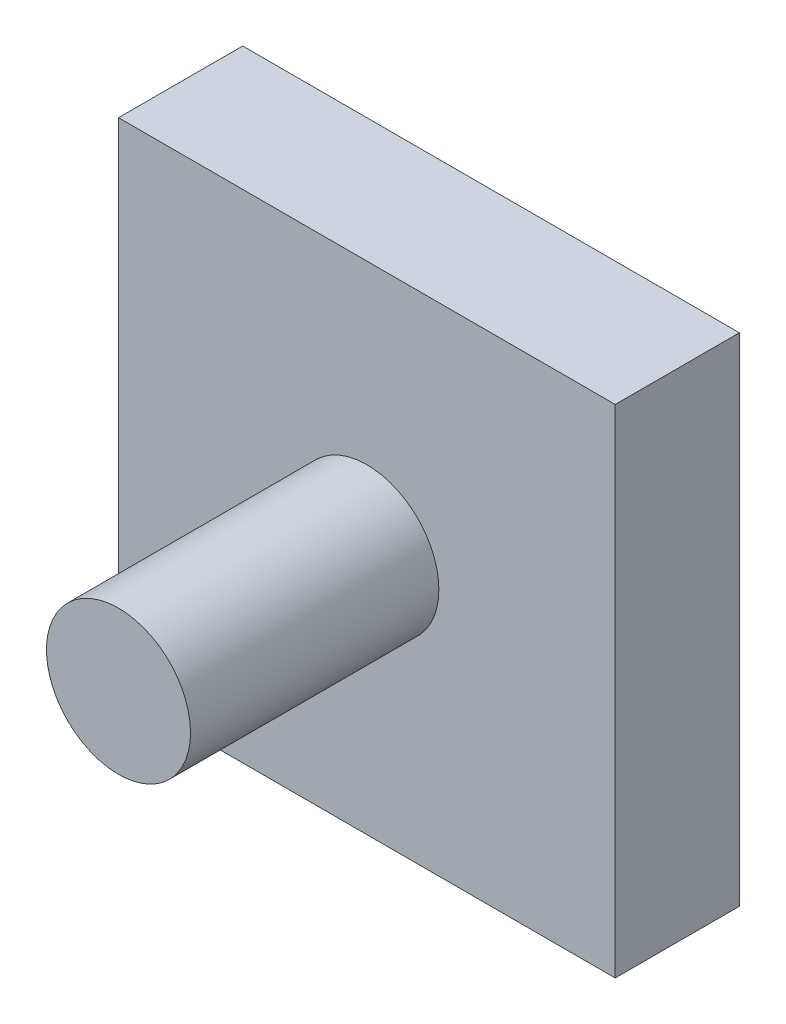
ISO-10303-21;
HEADER;
FILE_DESCRIPTION(('STEP AP214'),'2;1');
FILE_NAME('part.step','',(''),(''),'','','');
FILE_SCHEMA(('AUTOMOTIVE_DESIGN { 1 0 10303 214 1 1 1 1 }'));
ENDSEC;
DATA;
#1=APPLICATION_CONTEXT('core data for automotive mechanical design processes');
#2=APPLICATION_PROTOCOL_DEFINITION('international standard','automotive_design',2000,#1);
#3=PRODUCT_CONTEXT('',#1,'mechanical');
#4=PRODUCT('Part','Part','',(#3));
#5=PRODUCT_RELATED_PRODUCT_CATEGORY('part','',(#4));
#6=PRODUCT_DEFINITION_FORMATION('','',#4);
#7=PRODUCT_DEFINITION_CONTEXT('part definition',#1,'design');
#8=PRODUCT_DEFINITION('design','',#6,#7);
#9=PRODUCT_DEFINITION_SHAPE('','',#8);
#10=(LENGTH_UNIT() NAMED_UNIT(*) SI_UNIT(.MILLI.,.METRE.));
#11=(NAMED_UNIT(*) PLANE_ANGLE_UNIT() SI_UNIT($,.RADIAN.));
#12=(NAMED_UNIT(*) SI_UNIT($,.STERADIAN.) SOLID_ANGLE_UNIT());
#13=UNCERTAINTY_MEASURE_WITH_UNIT(LENGTH_MEASURE(1.E-05),#10,'distance_accuracy_value','');
#14=(GEOMETRIC_REPRESENTATION_CONTEXT(3) GLOBAL_UNCERTAINTY_ASSIGNED_CONTEXT((#13)) GLOBAL_UNIT_ASSIGNED_CONTEXT((#10,
#11,#12)) REPRESENTATION_CONTEXT('',''));
#15=CARTESIAN_POINT('',(0.,0.,0.));
#16=DIRECTION('',(0.,0.,1.));
#17=DIRECTION('',(1.,0.,0.));
#18=AXIS2_PLACEMENT_3D('',#15,#16,#17);
#19=CARTESIAN_POINT('',(100.,-100.,50.));
#20=DIRECTION('',(-1.,0.,0.));
#21=DIRECTION('',(0.,0.,1.));
#22=AXIS2_PLACEMENT_3D('',#19,#20,#21);
#23=PLANE('',#22);
#24=DIRECTION('',(0.,1.,0.));
#25=VECTOR('',#24,1.);
#26=CARTESIAN_POINT('',(100.,-100.,0.));
#27=LINE('',#26,#25);
#28=CARTESIAN_POINT('',(100.,-100.,0.));
#29=VERTEX_POINT('',#28);
#30=CARTESIAN_POINT('',(100.,100.,0.));
#31=VERTEX_POINT('',#30);
#32=EDGE_CURVE('E105',#29,#31,#27,.T.);
#33=ORIENTED_EDGE('',*,*,#32,.T.);
#34=DIRECTION('',(0.,0.,-1.));
#35=VECTOR('',#34,1.);
#36=CARTESIAN_POINT('',(100.,100.,50.));
#37=LINE('',#36,#35);
#38=CARTESIAN_POINT('',(100.,100.,50.));
#39=VERTEX_POINT('',#38);
#40=EDGE_CURVE('E42',#39,#31,#37,.T.);
#41=ORIENTED_EDGE('',*,*,#40,.F.);
#42=DIRECTION('',(0.,1.,0.));
#43=VECTOR('',#42,1.);
#44=CARTESIAN_POINT('',(100.,-100.,50.));
#45=LINE('',#44,#43);
#46=CARTESIAN_POINT('',(100.,-100.,50.));
#47=VERTEX_POINT('',#46);
#48=EDGE_CURVE('E92',#47,#39,#45,.T.);
#49=ORIENTED_EDGE('',*,*,#48,.F.);
#50=DIRECTION('',(0.,0.,-1.));
#51=VECTOR('',#50,1.);
#52=CARTESIAN_POINT('',(100.,-100.,50.));
#53=LINE('',#52,#51);
#54=EDGE_CURVE('E101',#47,#29,#53,.T.);
#55=ORIENTED_EDGE('',*,*,#54,.T.);
#56=EDGE_LOOP('',(#33,#41,#49,#55));
#57=FACE_BOUND('',#56,.T.);
#58=ADVANCED_FACE('F39',(#57),#23,.F.);
#59=CARTESIAN_POINT('',(-100.,100.,50.));
#60=DIRECTION('',(0.,-1.,0.));
#61=DIRECTION('',(0.,0.,-1.));
#62=AXIS2_PLACEMENT_3D('',#59,#60,#61);
#63=PLANE('',#62);
#64=DIRECTION('',(-1.,0.,0.));
#65=VECTOR('',#64,1.);
#66=CARTESIAN_POINT('',(-100.,100.,0.));
#67=LINE('',#66,#65);
#68=CARTESIAN_POINT('',(-100.,100.,0.));
#69=VERTEX_POINT('',#68);
#70=EDGE_CURVE('E97',#31,#69,#67,.T.);
#71=ORIENTED_EDGE('',*,*,#70,.T.);
#72=DIRECTION('',(0.,0.,-1.));
#73=VECTOR('',#72,1.);
#74=CARTESIAN_POINT('',(-100.,100.,50.));
#75=LINE('',#74,#73);
#76=CARTESIAN_POINT('',(-100.,100.,50.));
#77=VERTEX_POINT('',#76);
#78=EDGE_CURVE('E95',#77,#69,#75,.T.);
#79=ORIENTED_EDGE('',*,*,#78,.F.);
#80=DIRECTION('',(-1.,0.,0.));
#81=VECTOR('',#80,1.);
#82=CARTESIAN_POINT('',(-100.,100.,50.));
#83=LINE('',#82,#81);
#84=EDGE_CURVE('E87',#39,#77,#83,.T.);
#85=ORIENTED_EDGE('',*,*,#84,.F.);
#86=ORIENTED_EDGE('',*,*,#40,.T.);
#87=EDGE_LOOP('',(#71,#79,#85,#86));
#88=FACE_BOUND('',#87,.T.);
#89=ADVANCED_FACE('F96',(#88),#63,.F.);
#90=CARTESIAN_POINT('',(-100.,-100.,50.));
#91=DIRECTION('',(1.,0.,0.));
#92=DIRECTION('',(0.,0.,-1.));
#93=AXIS2_PLACEMENT_3D('',#90,#91,#92);
#94=PLANE('',#93);
#95=DIRECTION('',(0.,-1.,0.));
#96=VECTOR('',#95,1.);
#97=CARTESIAN_POINT('',(-100.,-100.,0.));
#98=LINE('',#97,#96);
#99=CARTESIAN_POINT('',(-100.,-100.,0.));
#100=VERTEX_POINT('',#99);
#101=EDGE_CURVE('E73',#69,#100,#98,.T.);
#102=ORIENTED_EDGE('',*,*,#101,.T.);
#103=DIRECTION('',(0.,0.,-1.));
#104=VECTOR('',#103,1.);
#105=CARTESIAN_POINT('',(-100.,-100.,50.));
#106=LINE('',#105,#104);
#107=CARTESIAN_POINT('',(-100.,-100.,50.));
#108=VERTEX_POINT('',#107);
#109=EDGE_CURVE('E98',#108,#100,#106,.T.);
#110=ORIENTED_EDGE('',*,*,#109,.F.);
#111=DIRECTION('',(0.,-1.,0.));
#112=VECTOR('',#111,1.);
#113=CARTESIAN_POINT('',(-100.,-100.,50.));
#114=LINE('',#113,#112);
#115=EDGE_CURVE('E90',#77,#108,#114,.T.);
#116=ORIENTED_EDGE('',*,*,#115,.F.);
#117=ORIENTED_EDGE('',*,*,#78,.T.);
#118=EDGE_LOOP('',(#102,#110,#116,#117));
#119=FACE_BOUND('',#118,.T.);
#120=ADVANCED_FACE('F99',(#119),#94,.F.);
#121=CARTESIAN_POINT('',(-100.,-100.,50.));
#122=DIRECTION('',(0.,1.,0.));
#123=DIRECTION('',(0.,0.,1.));
#124=AXIS2_PLACEMENT_3D('',#121,#122,#123);
#125=PLANE('',#124);
#126=DIRECTION('',(1.,0.,0.));
#127=VECTOR('',#126,1.);
#128=CARTESIAN_POINT('',(-100.,-100.,0.));
#129=LINE('',#128,#127);
#130=EDGE_CURVE('E79',#100,#29,#129,.T.);
#131=ORIENTED_EDGE('',*,*,#130,.T.);
#132=ORIENTED_EDGE('',*,*,#54,.F.);
#133=DIRECTION('',(1.,0.,0.));
#134=VECTOR('',#133,1.);
#135=CARTESIAN_POINT('',(-100.,-100.,50.));
#136=LINE('',#135,#134);
#137=EDGE_CURVE('E56',#108,#47,#136,.T.);
#138=ORIENTED_EDGE('',*,*,#137,.F.);
#139=ORIENTED_EDGE('',*,*,#109,.T.);
#140=EDGE_LOOP('',(#131,#132,#138,#139));
#141=FACE_BOUND('',#140,.T.);
#142=ADVANCED_FACE('F113',(#141),#125,.F.);
#143=CARTESIAN_POINT('',(0.,0.,50.));
#144=DIRECTION('',(0.,0.,-1.));
#145=DIRECTION('',(-1.,0.,0.));
#146=AXIS2_PLACEMENT_3D('',#143,#144,#145);
#147=PLANE('',#146);
#148=CARTESIAN_POINT('',(0.,0.,50.));
#149=DIRECTION('',(0.,0.,1.));
#150=DIRECTION('',(1.,0.,0.));
#151=AXIS2_PLACEMENT_3D('',#148,#149,#150);
#152=CIRCLE('',#151,29.);
#153=CARTESIAN_POINT('',(29.,0.,50.));
#154=VERTEX_POINT('',#153);
#155=EDGE_CURVE('E11',#154,#154,#152,.T.);
#156=ORIENTED_EDGE('',*,*,#155,.F.);
#157=EDGE_LOOP('',(#156));
#158=FACE_BOUND('',#157,.T.);
#159=ORIENTED_EDGE('',*,*,#48,.T.);
#160=ORIENTED_EDGE('',*,*,#84,.T.);
#161=ORIENTED_EDGE('',*,*,#115,.T.);
#162=ORIENTED_EDGE('',*,*,#137,.T.);
#163=EDGE_LOOP('',(#159,#160,#161,#162));
#164=FACE_BOUND('',#163,.T.);
#165=ADVANCED_FACE('F88',(#158,#164),#147,.F.);
#166=CARTESIAN_POINT('',(0.,0.,0.));
#167=DIRECTION('',(0.,0.,-1.));
#168=DIRECTION('',(-1.,0.,0.));
#169=AXIS2_PLACEMENT_3D('',#166,#167,#168);
#170=PLANE('',#169);
#171=ORIENTED_EDGE('',*,*,#32,.F.);
#172=ORIENTED_EDGE('',*,*,#130,.F.);
#173=ORIENTED_EDGE('',*,*,#101,.F.);
#174=ORIENTED_EDGE('',*,*,#70,.F.);
#175=EDGE_LOOP('',(#171,#172,#173,#174));
#176=FACE_BOUND('',#175,.T.);
#177=ADVANCED_FACE('F116',(#176),#170,.T.);
#178=CARTESIAN_POINT('',(0.,0.,150.));
#179=DIRECTION('',(0.,0.,-1.));
#180=DIRECTION('',(-1.,0.,0.));
#181=AXIS2_PLACEMENT_3D('',#178,#179,#180);
#182=CYLINDRICAL_SURFACE('',#181,29.);
#183=CARTESIAN_POINT('',(0.,0.,150.));
#184=DIRECTION('',(0.,0.,1.));
#185=DIRECTION('',(1.,0.,0.));
#186=AXIS2_PLACEMENT_3D('',#183,#184,#185);
#187=CIRCLE('',#186,29.);
#188=CARTESIAN_POINT('',(29.,0.,150.));
#189=VERTEX_POINT('',#188);
#190=EDGE_CURVE('E108',#189,#189,#187,.T.);
#191=ORIENTED_EDGE('',*,*,#190,.F.);
#192=EDGE_LOOP('',(#191));
#193=FACE_BOUND('',#192,.T.);
#194=ORIENTED_EDGE('',*,*,#155,.T.);
#195=EDGE_LOOP('',(#194));
#196=FACE_BOUND('',#195,.T.);
#197=ADVANCED_FACE('F124',(#193,#196),#182,.T.);
#198=CARTESIAN_POINT('',(0.,0.,150.));
#199=DIRECTION('',(0.,0.,1.));
#200=DIRECTION('',(1.,0.,0.));
#201=AXIS2_PLACEMENT_3D('',#198,#199,#200);
#202=PLANE('',#201);
#203=ORIENTED_EDGE('',*,*,#190,.T.);
#204=EDGE_LOOP('',(#203));
#205=FACE_BOUND('',#204,.T.);
#206=ADVANCED_FACE('F122',(#205),#202,.T.);
#207=CLOSED_SHELL('',(#58,#89,#120,#142,#165,#177,#197,#206));
#208=MANIFOLD_SOLID_BREP('B2',#207);
#209=ADVANCED_BREP_SHAPE_REPRESENTATION('',(#18,#208),#14);
#210=SHAPE_DEFINITION_REPRESENTATION(#9,#209);
ENDSEC;
END-ISO-10303-21;
